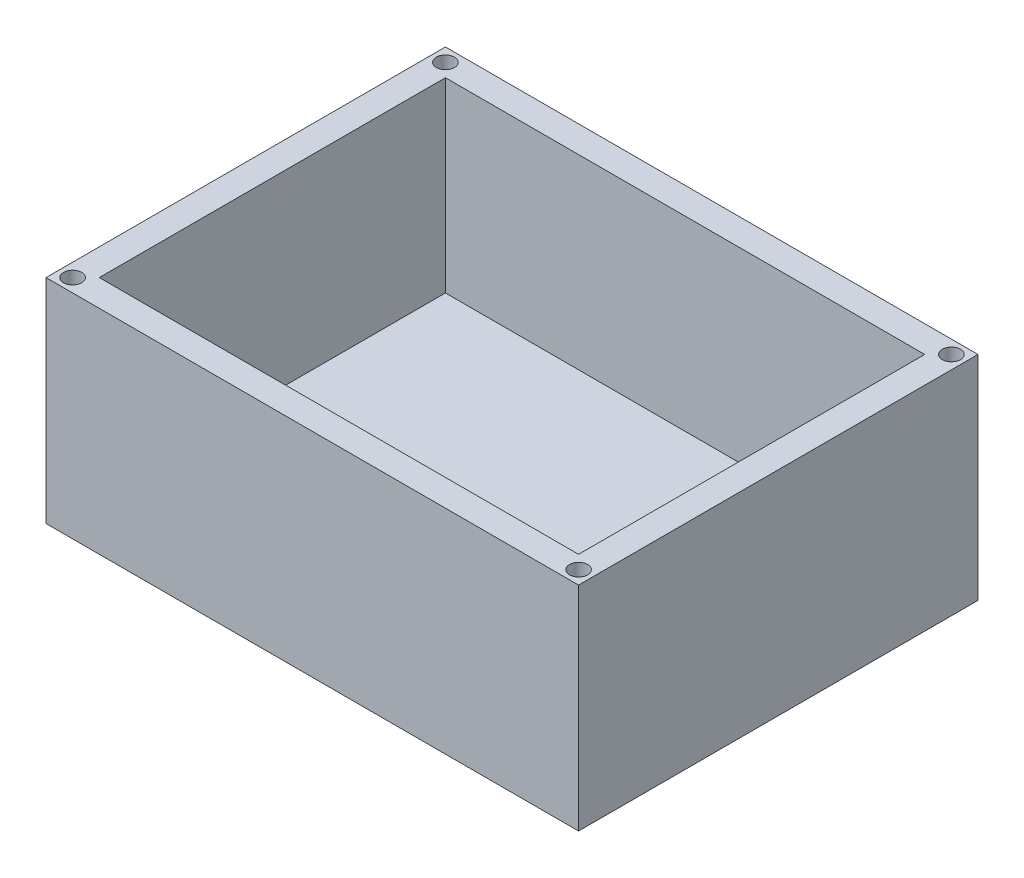
ISO-10303-21;
HEADER;
FILE_DESCRIPTION(('STEP AP214'),'2;1');
FILE_NAME('part.step','',(''),(''),'','','');
FILE_SCHEMA(('AUTOMOTIVE_DESIGN { 1 0 10303 214 1 1 1 1 }'));
ENDSEC;
DATA;
#1=APPLICATION_CONTEXT('core data for automotive mechanical design processes');
#2=APPLICATION_PROTOCOL_DEFINITION('international standard','automotive_design',2000,#1);
#3=PRODUCT_CONTEXT('',#1,'mechanical');
#4=PRODUCT('Part','Part','',(#3));
#5=PRODUCT_RELATED_PRODUCT_CATEGORY('part','',(#4));
#6=PRODUCT_DEFINITION_FORMATION('','',#4);
#7=PRODUCT_DEFINITION_CONTEXT('part definition',#1,'design');
#8=PRODUCT_DEFINITION('design','',#6,#7);
#9=PRODUCT_DEFINITION_SHAPE('','',#8);
#10=(LENGTH_UNIT() NAMED_UNIT(*) SI_UNIT(.MILLI.,.METRE.));
#11=(NAMED_UNIT(*) PLANE_ANGLE_UNIT() SI_UNIT($,.RADIAN.));
#12=(NAMED_UNIT(*) SI_UNIT($,.STERADIAN.) SOLID_ANGLE_UNIT());
#13=UNCERTAINTY_MEASURE_WITH_UNIT(LENGTH_MEASURE(1.E-05),#10,'distance_accuracy_value','');
#14=(GEOMETRIC_REPRESENTATION_CONTEXT(3) GLOBAL_UNCERTAINTY_ASSIGNED_CONTEXT((#13)) GLOBAL_UNIT_ASSIGNED_CONTEXT((#10,
#11,#12)) REPRESENTATION_CONTEXT('',''));
#15=CARTESIAN_POINT('',(0.,0.,0.));
#16=DIRECTION('',(0.,0.,1.));
#17=DIRECTION('',(1.,0.,0.));
#18=AXIS2_PLACEMENT_3D('',#15,#16,#17);
#19=CARTESIAN_POINT('',(0.,40.,0.));
#20=DIRECTION('',(0.,-1.,0.));
#21=DIRECTION('',(0.,0.,-1.));
#22=AXIS2_PLACEMENT_3D('',#19,#20,#21);
#23=PLANE('',#22);
#24=CARTESIAN_POINT('',(-22.4817193008492,40.,-11.7813638933177));
#25=DIRECTION('',(0.,1.,0.));
#26=DIRECTION('',(0.,0.,1.));
#27=AXIS2_PLACEMENT_3D('',#24,#25,#26);
#28=CIRCLE('',#27,1.7);
#29=CARTESIAN_POINT('',(-22.4817193008492,40.,-10.0813638933177));
#30=VERTEX_POINT('',#29);
#31=EDGE_CURVE('E125',#30,#30,#28,.T.);
#32=ORIENTED_EDGE('',*,*,#31,.F.);
#33=EDGE_LOOP('',(#32));
#34=FACE_BOUND('',#33,.T.);
#35=CARTESIAN_POINT('',(72.5182704019488,40.,-11.7813641264661));
#36=DIRECTION('',(0.,1.,0.));
#37=DIRECTION('',(0.,0.,1.));
#38=AXIS2_PLACEMENT_3D('',#35,#36,#37);
#39=CIRCLE('',#38,1.69999999999999);
#40=CARTESIAN_POINT('',(72.5182704019488,40.,-10.0813641264661));
#41=VERTEX_POINT('',#40);
#42=EDGE_CURVE('E124',#41,#41,#39,.T.);
#43=ORIENTED_EDGE('',*,*,#42,.F.);
#44=EDGE_LOOP('',(#43));
#45=FACE_BOUND('',#44,.T.);
#46=CARTESIAN_POINT('',(72.5182704019489,40.,58.2186358099878));
#47=DIRECTION('',(0.,1.,0.));
#48=DIRECTION('',(0.,0.,1.));
#49=AXIS2_PLACEMENT_3D('',#46,#47,#48);
#50=CIRCLE('',#49,1.69999999999999);
#51=CARTESIAN_POINT('',(72.5182704019489,40.,59.9186358099878));
#52=VERTEX_POINT('',#51);
#53=EDGE_CURVE('E135',#52,#52,#50,.T.);
#54=ORIENTED_EDGE('',*,*,#53,.F.);
#55=EDGE_LOOP('',(#54));
#56=FACE_BOUND('',#55,.T.);
#57=CARTESIAN_POINT('',(-22.4817182633575,40.,58.2186358099878));
#58=DIRECTION('',(0.,1.,0.));
#59=DIRECTION('',(0.,0.,1.));
#60=AXIS2_PLACEMENT_3D('',#57,#58,#59);
#61=CIRCLE('',#60,1.7);
#62=CARTESIAN_POINT('',(-22.4817182633575,40.,59.9186358099878));
#63=VERTEX_POINT('',#62);
#64=EDGE_CURVE('E141',#63,#63,#61,.T.);
#65=ORIENTED_EDGE('',*,*,#64,.F.);
#66=EDGE_LOOP('',(#65));
#67=FACE_BOUND('',#66,.T.);
#68=DIRECTION('',(0.,0.,1.));
#69=VECTOR('',#68,1.);
#70=CARTESIAN_POINT('',(-24.9817295980512,40.,-14.2813641900122));
#71=LINE('',#70,#69);
#72=CARTESIAN_POINT('',(-24.9817295980512,40.,-14.2813641900122));
#73=VERTEX_POINT('',#72);
#74=CARTESIAN_POINT('',(-24.9817295980511,40.,60.7186358099878));
#75=VERTEX_POINT('',#74);
#76=EDGE_CURVE('E173',#73,#75,#71,.T.);
#77=ORIENTED_EDGE('',*,*,#76,.T.);
#78=DIRECTION('',(1.,0.,0.));
#79=VECTOR('',#78,1.);
#80=CARTESIAN_POINT('',(75.0182704019489,40.,60.7186358099878));
#81=LINE('',#80,#79);
#82=CARTESIAN_POINT('',(75.0182704019489,40.,60.7186358099878));
#83=VERTEX_POINT('',#82);
#84=EDGE_CURVE('E176',#75,#83,#81,.T.);
#85=ORIENTED_EDGE('',*,*,#84,.T.);
#86=DIRECTION('',(0.,0.,-1.));
#87=VECTOR('',#86,1.);
#88=CARTESIAN_POINT('',(75.0182704019489,40.,-14.2813641900122));
#89=LINE('',#88,#87);
#90=CARTESIAN_POINT('',(75.0182704019489,40.,-14.2813641900122));
#91=VERTEX_POINT('',#90);
#92=EDGE_CURVE('E179',#83,#91,#89,.T.);
#93=ORIENTED_EDGE('',*,*,#92,.T.);
#94=DIRECTION('',(-1.,0.,0.));
#95=VECTOR('',#94,1.);
#96=CARTESIAN_POINT('',(-24.9817295980512,40.,-14.2813641900122));
#97=LINE('',#96,#95);
#98=EDGE_CURVE('E181',#91,#73,#97,.T.);
#99=ORIENTED_EDGE('',*,*,#98,.T.);
#100=EDGE_LOOP('',(#77,#85,#93,#99));
#101=FACE_BOUND('',#100,.T.);
#102=DIRECTION('',(0.,0.,1.));
#103=VECTOR('',#102,1.);
#104=CARTESIAN_POINT('',(-19.9817295980511,40.,-9.28136419001219));
#105=LINE('',#104,#103);
#106=CARTESIAN_POINT('',(-19.9817295980511,40.,-9.28136419001219));
#107=VERTEX_POINT('',#106);
#108=CARTESIAN_POINT('',(-19.9817295980511,40.,55.7186358099878));
#109=VERTEX_POINT('',#108);
#110=EDGE_CURVE('E155',#107,#109,#105,.T.);
#111=ORIENTED_EDGE('',*,*,#110,.F.);
#112=DIRECTION('',(-1.,0.,0.));
#113=VECTOR('',#112,1.);
#114=CARTESIAN_POINT('',(-19.9817295980511,40.,-9.28136419001219));
#115=LINE('',#114,#113);
#116=CARTESIAN_POINT('',(70.0182704019489,40.,-9.28136419001219));
#117=VERTEX_POINT('',#116);
#118=EDGE_CURVE('E162',#117,#107,#115,.T.);
#119=ORIENTED_EDGE('',*,*,#118,.F.);
#120=DIRECTION('',(0.,0.,-1.));
#121=VECTOR('',#120,1.);
#122=CARTESIAN_POINT('',(70.0182704019489,40.,-9.28136419001219));
#123=LINE('',#122,#121);
#124=CARTESIAN_POINT('',(70.0182704019489,40.,55.7186358099878));
#125=VERTEX_POINT('',#124);
#126=EDGE_CURVE('E159',#125,#117,#123,.T.);
#127=ORIENTED_EDGE('',*,*,#126,.F.);
#128=DIRECTION('',(1.,0.,0.));
#129=VECTOR('',#128,1.);
#130=CARTESIAN_POINT('',(-19.9817295980511,40.,55.7186358099878));
#131=LINE('',#130,#129);
#132=EDGE_CURVE('E157',#109,#125,#131,.T.);
#133=ORIENTED_EDGE('',*,*,#132,.F.);
#134=EDGE_LOOP('',(#111,#119,#127,#133));
#135=FACE_BOUND('',#134,.T.);
#136=ADVANCED_FACE('F36',(#34,#45,#56,#67,#101,#135),#23,.F.);
#137=CARTESIAN_POINT('',(0.,0.,0.));
#138=DIRECTION('',(0.,-1.,0.));
#139=DIRECTION('',(0.,0.,-1.));
#140=AXIS2_PLACEMENT_3D('',#137,#138,#139);
#141=PLANE('',#140);
#142=DIRECTION('',(0.,0.,1.));
#143=VECTOR('',#142,1.);
#144=CARTESIAN_POINT('',(-24.9817295980512,0.,-14.2813641900122));
#145=LINE('',#144,#143);
#146=CARTESIAN_POINT('',(-24.9817295980512,0.,-14.2813641900122));
#147=VERTEX_POINT('',#146);
#148=CARTESIAN_POINT('',(-24.9817295980511,0.,60.7186358099878));
#149=VERTEX_POINT('',#148);
#150=EDGE_CURVE('E172',#147,#149,#145,.T.);
#151=ORIENTED_EDGE('',*,*,#150,.F.);
#152=DIRECTION('',(-1.,0.,0.));
#153=VECTOR('',#152,1.);
#154=CARTESIAN_POINT('',(-24.9817295980512,0.,-14.2813641900122));
#155=LINE('',#154,#153);
#156=CARTESIAN_POINT('',(75.0182704019489,0.,-14.2813641900122));
#157=VERTEX_POINT('',#156);
#158=EDGE_CURVE('E177',#157,#147,#155,.T.);
#159=ORIENTED_EDGE('',*,*,#158,.F.);
#160=DIRECTION('',(0.,0.,-1.));
#161=VECTOR('',#160,1.);
#162=CARTESIAN_POINT('',(75.0182704019489,0.,-14.2813641900122));
#163=LINE('',#162,#161);
#164=CARTESIAN_POINT('',(75.0182704019489,0.,60.7186358099878));
#165=VERTEX_POINT('',#164);
#166=EDGE_CURVE('E188',#165,#157,#163,.T.);
#167=ORIENTED_EDGE('',*,*,#166,.F.);
#168=DIRECTION('',(1.,0.,0.));
#169=VECTOR('',#168,1.);
#170=CARTESIAN_POINT('',(75.0182704019489,0.,60.7186358099878));
#171=LINE('',#170,#169);
#172=EDGE_CURVE('E186',#149,#165,#171,.T.);
#173=ORIENTED_EDGE('',*,*,#172,.F.);
#174=EDGE_LOOP('',(#151,#159,#167,#173));
#175=FACE_BOUND('',#174,.T.);
#176=ADVANCED_FACE('F206',(#175),#141,.T.);
#177=CARTESIAN_POINT('',(-24.9817295980512,40.,-14.2813641900122));
#178=DIRECTION('',(1.,0.,0.));
#179=DIRECTION('',(0.,0.,-1.));
#180=AXIS2_PLACEMENT_3D('',#177,#178,#179);
#181=PLANE('',#180);
#182=ORIENTED_EDGE('',*,*,#150,.T.);
#183=DIRECTION('',(0.,-1.,0.));
#184=VECTOR('',#183,1.);
#185=CARTESIAN_POINT('',(-24.9817295980511,40.,60.7186358099878));
#186=LINE('',#185,#184);
#187=EDGE_CURVE('E11',#75,#149,#186,.T.);
#188=ORIENTED_EDGE('',*,*,#187,.F.);
#189=ORIENTED_EDGE('',*,*,#76,.F.);
#190=DIRECTION('',(0.,-1.,0.));
#191=VECTOR('',#190,1.);
#192=CARTESIAN_POINT('',(-24.9817295980512,40.,-14.2813641900122));
#193=LINE('',#192,#191);
#194=EDGE_CURVE('E183',#73,#147,#193,.T.);
#195=ORIENTED_EDGE('',*,*,#194,.T.);
#196=EDGE_LOOP('',(#182,#188,#189,#195));
#197=FACE_BOUND('',#196,.T.);
#198=ADVANCED_FACE('F38',(#197),#181,.F.);
#199=CARTESIAN_POINT('',(75.0182704019489,40.,60.7186358099878));
#200=DIRECTION('',(0.,0.,-1.));
#201=DIRECTION('',(-1.,0.,0.));
#202=AXIS2_PLACEMENT_3D('',#199,#200,#201);
#203=PLANE('',#202);
#204=ORIENTED_EDGE('',*,*,#172,.T.);
#205=DIRECTION('',(0.,-1.,0.));
#206=VECTOR('',#205,1.);
#207=CARTESIAN_POINT('',(75.0182704019489,40.,60.7186358099878));
#208=LINE('',#207,#206);
#209=EDGE_CURVE('E44',#83,#165,#208,.T.);
#210=ORIENTED_EDGE('',*,*,#209,.F.);
#211=ORIENTED_EDGE('',*,*,#84,.F.);
#212=ORIENTED_EDGE('',*,*,#187,.T.);
#213=EDGE_LOOP('',(#204,#210,#211,#212));
#214=FACE_BOUND('',#213,.T.);
#215=ADVANCED_FACE('F216',(#214),#203,.F.);
#216=CARTESIAN_POINT('',(75.0182704019489,40.,-14.2813641900122));
#217=DIRECTION('',(-1.,0.,0.));
#218=DIRECTION('',(0.,0.,1.));
#219=AXIS2_PLACEMENT_3D('',#216,#217,#218);
#220=PLANE('',#219);
#221=ORIENTED_EDGE('',*,*,#166,.T.);
#222=DIRECTION('',(0.,-1.,0.));
#223=VECTOR('',#222,1.);
#224=CARTESIAN_POINT('',(75.0182704019489,40.,-14.2813641900122));
#225=LINE('',#224,#223);
#226=EDGE_CURVE('E193',#91,#157,#225,.T.);
#227=ORIENTED_EDGE('',*,*,#226,.F.);
#228=ORIENTED_EDGE('',*,*,#92,.F.);
#229=ORIENTED_EDGE('',*,*,#209,.T.);
#230=EDGE_LOOP('',(#221,#227,#228,#229));
#231=FACE_BOUND('',#230,.T.);
#232=ADVANCED_FACE('F200',(#231),#220,.F.);
#233=CARTESIAN_POINT('',(-24.9817295980512,40.,-14.2813641900122));
#234=DIRECTION('',(0.,0.,1.));
#235=DIRECTION('',(1.,0.,0.));
#236=AXIS2_PLACEMENT_3D('',#233,#234,#235);
#237=PLANE('',#236);
#238=ORIENTED_EDGE('',*,*,#158,.T.);
#239=ORIENTED_EDGE('',*,*,#194,.F.);
#240=ORIENTED_EDGE('',*,*,#98,.F.);
#241=ORIENTED_EDGE('',*,*,#226,.T.);
#242=EDGE_LOOP('',(#238,#239,#240,#241));
#243=FACE_BOUND('',#242,.T.);
#244=ADVANCED_FACE('F209',(#243),#237,.F.);
#245=CARTESIAN_POINT('',(-19.9817295980511,40.,-9.28136419001219));
#246=DIRECTION('',(1.,0.,0.));
#247=DIRECTION('',(0.,0.,-1.));
#248=AXIS2_PLACEMENT_3D('',#245,#246,#247);
#249=PLANE('',#248);
#250=DIRECTION('',(0.,0.,1.));
#251=VECTOR('',#250,1.);
#252=CARTESIAN_POINT('',(-19.9817295980511,5.,-9.28136419001219));
#253=LINE('',#252,#251);
#254=CARTESIAN_POINT('',(-19.9817295980511,5.,-9.28136419001219));
#255=VERTEX_POINT('',#254);
#256=CARTESIAN_POINT('',(-19.9817295980511,5.,55.7186358099878));
#257=VERTEX_POINT('',#256);
#258=EDGE_CURVE('E147',#255,#257,#253,.T.);
#259=ORIENTED_EDGE('',*,*,#258,.F.);
#260=DIRECTION('',(0.,-1.,0.));
#261=VECTOR('',#260,1.);
#262=CARTESIAN_POINT('',(-19.9817295980511,40.,-9.28136419001219));
#263=LINE('',#262,#261);
#264=EDGE_CURVE('E164',#107,#255,#263,.T.);
#265=ORIENTED_EDGE('',*,*,#264,.F.);
#266=ORIENTED_EDGE('',*,*,#110,.T.);
#267=DIRECTION('',(0.,-1.,0.));
#268=VECTOR('',#267,1.);
#269=CARTESIAN_POINT('',(-19.9817295980511,40.,55.7186358099878));
#270=LINE('',#269,#268);
#271=EDGE_CURVE('E170',#109,#257,#270,.T.);
#272=ORIENTED_EDGE('',*,*,#271,.T.);
#273=EDGE_LOOP('',(#259,#265,#266,#272));
#274=FACE_BOUND('',#273,.T.);
#275=ADVANCED_FACE('F233',(#274),#249,.T.);
#276=CARTESIAN_POINT('',(-19.9817295980511,40.,55.7186358099878));
#277=DIRECTION('',(0.,0.,-1.));
#278=DIRECTION('',(-1.,0.,0.));
#279=AXIS2_PLACEMENT_3D('',#276,#277,#278);
#280=PLANE('',#279);
#281=DIRECTION('',(1.,0.,0.));
#282=VECTOR('',#281,1.);
#283=CARTESIAN_POINT('',(-19.9817295980511,5.,55.7186358099878));
#284=LINE('',#283,#282);
#285=CARTESIAN_POINT('',(70.0182704019489,5.,55.7186358099878));
#286=VERTEX_POINT('',#285);
#287=EDGE_CURVE('E51',#257,#286,#284,.T.);
#288=ORIENTED_EDGE('',*,*,#287,.F.);
#289=ORIENTED_EDGE('',*,*,#271,.F.);
#290=ORIENTED_EDGE('',*,*,#132,.T.);
#291=DIRECTION('',(0.,-1.,0.));
#292=VECTOR('',#291,1.);
#293=CARTESIAN_POINT('',(70.0182704019489,40.,55.7186358099878));
#294=LINE('',#293,#292);
#295=EDGE_CURVE('E168',#125,#286,#294,.T.);
#296=ORIENTED_EDGE('',*,*,#295,.T.);
#297=EDGE_LOOP('',(#288,#289,#290,#296));
#298=FACE_BOUND('',#297,.T.);
#299=ADVANCED_FACE('F240',(#298),#280,.T.);
#300=CARTESIAN_POINT('',(70.0182704019489,40.,-9.28136419001219));
#301=DIRECTION('',(-1.,0.,0.));
#302=DIRECTION('',(0.,0.,1.));
#303=AXIS2_PLACEMENT_3D('',#300,#301,#302);
#304=PLANE('',#303);
#305=DIRECTION('',(0.,0.,-1.));
#306=VECTOR('',#305,1.);
#307=CARTESIAN_POINT('',(70.0182704019489,5.,-9.28136419001219));
#308=LINE('',#307,#306);
#309=CARTESIAN_POINT('',(70.0182704019489,5.,-9.28136419001219));
#310=VERTEX_POINT('',#309);
#311=EDGE_CURVE('E59',#286,#310,#308,.T.);
#312=ORIENTED_EDGE('',*,*,#311,.F.);
#313=ORIENTED_EDGE('',*,*,#295,.F.);
#314=ORIENTED_EDGE('',*,*,#126,.T.);
#315=DIRECTION('',(0.,-1.,0.));
#316=VECTOR('',#315,1.);
#317=CARTESIAN_POINT('',(70.0182704019489,40.,-9.28136419001219));
#318=LINE('',#317,#316);
#319=EDGE_CURVE('E166',#117,#310,#318,.T.);
#320=ORIENTED_EDGE('',*,*,#319,.T.);
#321=EDGE_LOOP('',(#312,#313,#314,#320));
#322=FACE_BOUND('',#321,.T.);
#323=ADVANCED_FACE('F245',(#322),#304,.T.);
#324=CARTESIAN_POINT('',(-19.9817295980511,40.,-9.28136419001219));
#325=DIRECTION('',(0.,0.,1.));
#326=DIRECTION('',(1.,0.,0.));
#327=AXIS2_PLACEMENT_3D('',#324,#325,#326);
#328=PLANE('',#327);
#329=DIRECTION('',(-1.,0.,0.));
#330=VECTOR('',#329,1.);
#331=CARTESIAN_POINT('',(-19.9817295980511,5.,-9.28136419001219));
#332=LINE('',#331,#330);
#333=EDGE_CURVE('E152',#310,#255,#332,.T.);
#334=ORIENTED_EDGE('',*,*,#333,.F.);
#335=ORIENTED_EDGE('',*,*,#319,.F.);
#336=ORIENTED_EDGE('',*,*,#118,.T.);
#337=ORIENTED_EDGE('',*,*,#264,.T.);
#338=EDGE_LOOP('',(#334,#335,#336,#337));
#339=FACE_BOUND('',#338,.T.);
#340=ADVANCED_FACE('F252',(#339),#328,.T.);
#341=CARTESIAN_POINT('',(0.,5.,0.));
#342=DIRECTION('',(0.,1.,0.));
#343=DIRECTION('',(0.,0.,1.));
#344=AXIS2_PLACEMENT_3D('',#341,#342,#343);
#345=PLANE('',#344);
#346=ORIENTED_EDGE('',*,*,#258,.T.);
#347=ORIENTED_EDGE('',*,*,#287,.T.);
#348=ORIENTED_EDGE('',*,*,#311,.T.);
#349=ORIENTED_EDGE('',*,*,#333,.T.);
#350=EDGE_LOOP('',(#346,#347,#348,#349));
#351=FACE_BOUND('',#350,.T.);
#352=ADVANCED_FACE('F250',(#351),#345,.T.);
#353=CARTESIAN_POINT('',(-22.4817182633575,20.,58.2186358099878));
#354=DIRECTION('',(0.,1.,0.));
#355=DIRECTION('',(0.,0.,1.));
#356=AXIS2_PLACEMENT_3D('',#353,#354,#355);
#357=CONICAL_SURFACE('',#356,1.7,1.02974425867665);
#358=CARTESIAN_POINT('',(-22.4817182633575,18.9785369476531,58.2186358099878));
#359=VERTEX_POINT('',#358);
#360=VERTEX_LOOP('',#359);
#361=FACE_BOUND('',#360,.T.);
#362=CARTESIAN_POINT('',(-22.4817182633575,20.,58.2186358099878));
#363=DIRECTION('',(0.,1.,0.));
#364=DIRECTION('',(0.,0.,1.));
#365=AXIS2_PLACEMENT_3D('',#362,#363,#364);
#366=CIRCLE('',#365,1.7);
#367=CARTESIAN_POINT('',(-22.4817182633575,20.,59.9186358099878));
#368=VERTEX_POINT('',#367);
#369=EDGE_CURVE('E144',#368,#368,#366,.T.);
#370=ORIENTED_EDGE('',*,*,#369,.T.);
#371=EDGE_LOOP('',(#370));
#372=FACE_BOUND('',#371,.T.);
#373=ADVANCED_FACE('F265',(#361,#372),#357,.F.);
#374=CARTESIAN_POINT('',(-22.4817182633575,40.,58.2186358099878));
#375=DIRECTION('',(0.,1.,0.));
#376=DIRECTION('',(0.,0.,1.));
#377=AXIS2_PLACEMENT_3D('',#374,#375,#376);
#378=CYLINDRICAL_SURFACE('',#377,1.7);
#379=ORIENTED_EDGE('',*,*,#369,.F.);
#380=EDGE_LOOP('',(#379));
#381=FACE_BOUND('',#380,.T.);
#382=ORIENTED_EDGE('',*,*,#64,.T.);
#383=EDGE_LOOP('',(#382));
#384=FACE_BOUND('',#383,.T.);
#385=ADVANCED_FACE('F268',(#381,#384),#378,.F.);
#386=CARTESIAN_POINT('',(72.5182704019489,20.,58.2186358099878));
#387=DIRECTION('',(0.,1.,0.));
#388=DIRECTION('',(0.,0.,1.));
#389=AXIS2_PLACEMENT_3D('',#386,#387,#388);
#390=CONICAL_SURFACE('',#389,1.69999999999999,1.02974425867665);
#391=CARTESIAN_POINT('',(72.5182704019489,18.9785369476531,58.2186358099878));
#392=VERTEX_POINT('',#391);
#393=VERTEX_LOOP('',#392);
#394=FACE_BOUND('',#393,.T.);
#395=CARTESIAN_POINT('',(72.5182704019489,20.,58.2186358099878));
#396=DIRECTION('',(0.,1.,0.));
#397=DIRECTION('',(0.,0.,1.));
#398=AXIS2_PLACEMENT_3D('',#395,#396,#397);
#399=CIRCLE('',#398,1.69999999999999);
#400=CARTESIAN_POINT('',(72.5182704019489,20.,59.9186358099878));
#401=VERTEX_POINT('',#400);
#402=EDGE_CURVE('E138',#401,#401,#399,.T.);
#403=ORIENTED_EDGE('',*,*,#402,.T.);
#404=EDGE_LOOP('',(#403));
#405=FACE_BOUND('',#404,.T.);
#406=ADVANCED_FACE('F272',(#394,#405),#390,.F.);
#407=CARTESIAN_POINT('',(72.5182704019489,40.,58.2186358099878));
#408=DIRECTION('',(0.,1.,0.));
#409=DIRECTION('',(0.,0.,1.));
#410=AXIS2_PLACEMENT_3D('',#407,#408,#409);
#411=CYLINDRICAL_SURFACE('',#410,1.69999999999999);
#412=ORIENTED_EDGE('',*,*,#402,.F.);
#413=EDGE_LOOP('',(#412));
#414=FACE_BOUND('',#413,.T.);
#415=ORIENTED_EDGE('',*,*,#53,.T.);
#416=EDGE_LOOP('',(#415));
#417=FACE_BOUND('',#416,.T.);
#418=ADVANCED_FACE('F276',(#414,#417),#411,.F.);
#419=CARTESIAN_POINT('',(72.5182704019488,20.,-11.7813641264661));
#420=DIRECTION('',(0.,1.,0.));
#421=DIRECTION('',(0.,0.,1.));
#422=AXIS2_PLACEMENT_3D('',#419,#420,#421);
#423=CONICAL_SURFACE('',#422,1.69999999999999,1.02974425867665);
#424=CARTESIAN_POINT('',(72.5182704019488,18.9785369476531,-11.7813641264661));
#425=VERTEX_POINT('',#424);
#426=VERTEX_LOOP('',#425);
#427=FACE_BOUND('',#426,.T.);
#428=CARTESIAN_POINT('',(72.5182704019488,20.,-11.7813641264661));
#429=DIRECTION('',(0.,1.,0.));
#430=DIRECTION('',(0.,0.,1.));
#431=AXIS2_PLACEMENT_3D('',#428,#429,#430);
#432=CIRCLE('',#431,1.69999999999999);
#433=CARTESIAN_POINT('',(72.5182704019488,20.,-10.0813641264661));
#434=VERTEX_POINT('',#433);
#435=EDGE_CURVE('E128',#434,#434,#432,.T.);
#436=ORIENTED_EDGE('',*,*,#435,.T.);
#437=EDGE_LOOP('',(#436));
#438=FACE_BOUND('',#437,.T.);
#439=ADVANCED_FACE('F280',(#427,#438),#423,.F.);
#440=CARTESIAN_POINT('',(72.5182704019488,40.,-11.7813641264661));
#441=DIRECTION('',(0.,1.,0.));
#442=DIRECTION('',(0.,0.,1.));
#443=AXIS2_PLACEMENT_3D('',#440,#441,#442);
#444=CYLINDRICAL_SURFACE('',#443,1.69999999999999);
#445=ORIENTED_EDGE('',*,*,#435,.F.);
#446=EDGE_LOOP('',(#445));
#447=FACE_BOUND('',#446,.T.);
#448=ORIENTED_EDGE('',*,*,#42,.T.);
#449=EDGE_LOOP('',(#448));
#450=FACE_BOUND('',#449,.T.);
#451=ADVANCED_FACE('F118',(#447,#450),#444,.F.);
#452=CARTESIAN_POINT('',(-22.4817193008492,20.,-11.7813638933177));
#453=DIRECTION('',(0.,1.,0.));
#454=DIRECTION('',(0.,0.,1.));
#455=AXIS2_PLACEMENT_3D('',#452,#453,#454);
#456=CONICAL_SURFACE('',#455,1.69999999999999,1.02974425867665);
#457=CARTESIAN_POINT('',(-22.4817193008492,18.9785369476531,-11.7813638933177));
#458=VERTEX_POINT('',#457);
#459=VERTEX_LOOP('',#458);
#460=FACE_BOUND('',#459,.T.);
#461=CARTESIAN_POINT('',(-22.4817193008492,20.,-11.7813638933177));
#462=DIRECTION('',(0.,1.,0.));
#463=DIRECTION('',(0.,0.,1.));
#464=AXIS2_PLACEMENT_3D('',#461,#462,#463);
#465=CIRCLE('',#464,1.69999999999999);
#466=CARTESIAN_POINT('',(-22.4817193008492,20.,-10.0813638933177));
#467=VERTEX_POINT('',#466);
#468=EDGE_CURVE('E122',#467,#467,#465,.T.);
#469=ORIENTED_EDGE('',*,*,#468,.T.);
#470=EDGE_LOOP('',(#469));
#471=FACE_BOUND('',#470,.T.);
#472=ADVANCED_FACE('F114',(#460,#471),#456,.F.);
#473=CARTESIAN_POINT('',(-22.4817193008492,40.,-11.7813638933177));
#474=DIRECTION('',(0.,1.,0.));
#475=DIRECTION('',(0.,0.,1.));
#476=AXIS2_PLACEMENT_3D('',#473,#474,#475);
#477=CYLINDRICAL_SURFACE('',#476,1.69999999999999);
#478=ORIENTED_EDGE('',*,*,#468,.F.);
#479=EDGE_LOOP('',(#478));
#480=FACE_BOUND('',#479,.T.);
#481=ORIENTED_EDGE('',*,*,#31,.T.);
#482=EDGE_LOOP('',(#481));
#483=FACE_BOUND('',#482,.T.);
#484=ADVANCED_FACE('F117',(#480,#483),#477,.F.);
#485=CLOSED_SHELL('',(#136,#176,#198,#215,#232,#244,#275,#299,#323,#340,#352,#373,#385,#406,
#418,#439,#451,#472,#484));
#486=MANIFOLD_SOLID_BREP('B2',#485);
#487=ADVANCED_BREP_SHAPE_REPRESENTATION('',(#18,#486),#14);
#488=SHAPE_DEFINITION_REPRESENTATION(#9,#487);
ENDSEC;
END-ISO-10303-21;
